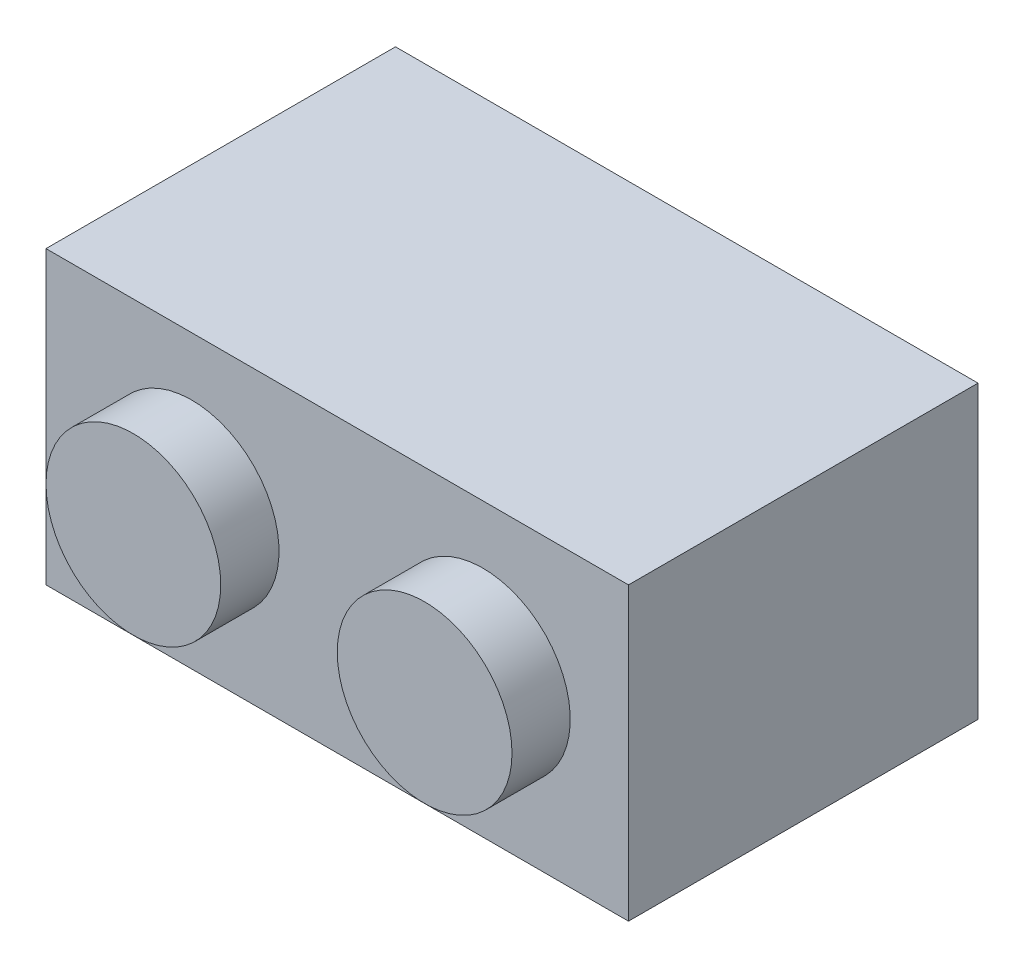
ISO-10303-21;
HEADER;
FILE_DESCRIPTION(('STEP AP214'),'2;1');
FILE_NAME('part.step','',(''),(''),'','','');
FILE_SCHEMA(('AUTOMOTIVE_DESIGN { 1 0 10303 214 1 1 1 1 }'));
ENDSEC;
DATA;
#1=APPLICATION_CONTEXT('core data for automotive mechanical design processes');
#2=APPLICATION_PROTOCOL_DEFINITION('international standard','automotive_design',2000,#1);
#3=PRODUCT_CONTEXT('',#1,'mechanical');
#4=PRODUCT('Part','Part','',(#3));
#5=PRODUCT_RELATED_PRODUCT_CATEGORY('part','',(#4));
#6=PRODUCT_DEFINITION_FORMATION('','',#4);
#7=PRODUCT_DEFINITION_CONTEXT('part definition',#1,'design');
#8=PRODUCT_DEFINITION('design','',#6,#7);
#9=PRODUCT_DEFINITION_SHAPE('','',#8);
#10=(LENGTH_UNIT() NAMED_UNIT(*) SI_UNIT(.MILLI.,.METRE.));
#11=(NAMED_UNIT(*) PLANE_ANGLE_UNIT() SI_UNIT($,.RADIAN.));
#12=(NAMED_UNIT(*) SI_UNIT($,.STERADIAN.) SOLID_ANGLE_UNIT());
#13=UNCERTAINTY_MEASURE_WITH_UNIT(LENGTH_MEASURE(1.E-05),#10,'distance_accuracy_value','');
#14=(GEOMETRIC_REPRESENTATION_CONTEXT(3) GLOBAL_UNCERTAINTY_ASSIGNED_CONTEXT((#13)) GLOBAL_UNIT_ASSIGNED_CONTEXT((#10,
#11,#12)) REPRESENTATION_CONTEXT('',''));
#15=CARTESIAN_POINT('',(0.,0.,0.));
#16=DIRECTION('',(0.,0.,1.));
#17=DIRECTION('',(1.,0.,0.));
#18=AXIS2_PLACEMENT_3D('',#15,#16,#17);
#19=CARTESIAN_POINT('',(0.,0.,7.9375));
#20=DIRECTION('',(0.,0.,-1.));
#21=DIRECTION('',(-1.,0.,0.));
#22=AXIS2_PLACEMENT_3D('',#19,#20,#21);
#23=PLANE('',#22);
#24=CARTESIAN_POINT('',(11.90625,3.96875,7.9375));
#25=DIRECTION('',(0.,0.,-1.));
#26=DIRECTION('',(-1.,0.,0.));
#27=AXIS2_PLACEMENT_3D('',#24,#25,#26);
#28=CIRCLE('',#27,0.793750000000002);
#29=CARTESIAN_POINT('',(11.1125,3.96875,7.9375));
#30=VERTEX_POINT('',#29);
#31=EDGE_CURVE('E131',#30,#30,#28,.F.);
#32=ORIENTED_EDGE('',*,*,#31,.T.);
#33=EDGE_LOOP('',(#32));
#34=FACE_BOUND('',#33,.T.);
#35=DIRECTION('',(0.,1.,0.));
#36=VECTOR('',#35,1.);
#37=CARTESIAN_POINT('',(1.5875,0.,7.9375));
#38=LINE('',#37,#36);
#39=CARTESIAN_POINT('',(1.5875,1.5875,7.9375));
#40=VERTEX_POINT('',#39);
#41=CARTESIAN_POINT('',(1.5875,6.35,7.9375));
#42=VERTEX_POINT('',#41);
#43=EDGE_CURVE('E127',#40,#42,#38,.T.);
#44=ORIENTED_EDGE('',*,*,#43,.T.);
#45=DIRECTION('',(1.,0.,0.));
#46=VECTOR('',#45,1.);
#47=CARTESIAN_POINT('',(0.,6.35,7.9375));
#48=LINE('',#47,#46);
#49=CARTESIAN_POINT('',(14.2875,6.35,7.9375));
#50=VERTEX_POINT('',#49);
#51=EDGE_CURVE('E125',#42,#50,#48,.T.);
#52=ORIENTED_EDGE('',*,*,#51,.T.);
#53=DIRECTION('',(0.,1.,0.));
#54=VECTOR('',#53,1.);
#55=CARTESIAN_POINT('',(14.2875,0.,7.9375));
#56=LINE('',#55,#54);
#57=CARTESIAN_POINT('',(14.2875,1.5875,7.9375));
#58=VERTEX_POINT('',#57);
#59=EDGE_CURVE('E116',#58,#50,#56,.T.);
#60=ORIENTED_EDGE('',*,*,#59,.F.);
#61=DIRECTION('',(1.,0.,0.));
#62=VECTOR('',#61,1.);
#63=CARTESIAN_POINT('',(0.,1.5875,7.9375));
#64=LINE('',#63,#62);
#65=EDGE_CURVE('E105',#40,#58,#64,.T.);
#66=ORIENTED_EDGE('',*,*,#65,.F.);
#67=EDGE_LOOP('',(#44,#52,#60,#66));
#68=FACE_BOUND('',#67,.T.);
#69=CARTESIAN_POINT('',(3.96875,3.96875,7.9375));
#70=DIRECTION('',(0.,0.,-1.));
#71=DIRECTION('',(-1.,0.,0.));
#72=AXIS2_PLACEMENT_3D('',#69,#70,#71);
#73=CIRCLE('',#72,0.793750000000002);
#74=CARTESIAN_POINT('',(3.175,3.96875,7.9375));
#75=VERTEX_POINT('',#74);
#76=EDGE_CURVE('E135',#75,#75,#73,.F.);
#77=ORIENTED_EDGE('',*,*,#76,.T.);
#78=EDGE_LOOP('',(#77));
#79=FACE_BOUND('',#78,.T.);
#80=CARTESIAN_POINT('',(7.9375,3.96875,7.9375));
#81=DIRECTION('',(0.,0.,-1.));
#82=DIRECTION('',(-1.,0.,0.));
#83=AXIS2_PLACEMENT_3D('',#80,#81,#82);
#84=CIRCLE('',#83,1.5875);
#85=CARTESIAN_POINT('',(6.35,3.96875,7.9375));
#86=VERTEX_POINT('',#85);
#87=EDGE_CURVE('E266',#86,#86,#84,.T.);
#88=ORIENTED_EDGE('',*,*,#87,.F.);
#89=EDGE_LOOP('',(#88));
#90=FACE_BOUND('',#89,.T.);
#91=ADVANCED_FACE('F32',(#34,#68,#79,#90),#23,.T.);
#92=CARTESIAN_POINT('',(0.,0.,9.525));
#93=DIRECTION('',(0.,0.,-1.));
#94=DIRECTION('',(-1.,0.,0.));
#95=AXIS2_PLACEMENT_3D('',#92,#93,#94);
#96=PLANE('',#95);
#97=CARTESIAN_POINT('',(3.96875,3.96875,9.525));
#98=DIRECTION('',(0.,0.,-1.));
#99=DIRECTION('',(-1.,0.,0.));
#100=AXIS2_PLACEMENT_3D('',#97,#98,#99);
#101=CIRCLE('',#100,2.38125);
#102=CARTESIAN_POINT('',(1.5875,3.96875,9.525));
#103=VERTEX_POINT('',#102);
#104=EDGE_CURVE('E40',#103,#103,#101,.F.);
#105=ORIENTED_EDGE('',*,*,#104,.F.);
#106=EDGE_LOOP('',(#105));
#107=FACE_BOUND('',#106,.T.);
#108=DIRECTION('',(0.,1.,0.));
#109=VECTOR('',#108,1.);
#110=CARTESIAN_POINT('',(0.,0.,9.525));
#111=LINE('',#110,#109);
#112=CARTESIAN_POINT('',(0.,0.,9.525));
#113=VERTEX_POINT('',#112);
#114=CARTESIAN_POINT('',(0.,7.9375,9.525));
#115=VERTEX_POINT('',#114);
#116=EDGE_CURVE('E161',#113,#115,#111,.T.);
#117=ORIENTED_EDGE('',*,*,#116,.F.);
#118=DIRECTION('',(1.,0.,0.));
#119=VECTOR('',#118,1.);
#120=CARTESIAN_POINT('',(0.,0.,9.525));
#121=LINE('',#120,#119);
#122=CARTESIAN_POINT('',(15.875,0.,9.525));
#123=VERTEX_POINT('',#122);
#124=EDGE_CURVE('E168',#113,#123,#121,.T.);
#125=ORIENTED_EDGE('',*,*,#124,.T.);
#126=DIRECTION('',(0.,1.,0.));
#127=VECTOR('',#126,1.);
#128=CARTESIAN_POINT('',(15.875,0.,9.525));
#129=LINE('',#128,#127);
#130=CARTESIAN_POINT('',(15.875,7.9375,9.525));
#131=VERTEX_POINT('',#130);
#132=EDGE_CURVE('E166',#123,#131,#129,.T.);
#133=ORIENTED_EDGE('',*,*,#132,.T.);
#134=DIRECTION('',(1.,0.,0.));
#135=VECTOR('',#134,1.);
#136=CARTESIAN_POINT('',(0.,7.9375,9.525));
#137=LINE('',#136,#135);
#138=EDGE_CURVE('E163',#115,#131,#137,.T.);
#139=ORIENTED_EDGE('',*,*,#138,.F.);
#140=EDGE_LOOP('',(#117,#125,#133,#139));
#141=FACE_BOUND('',#140,.T.);
#142=CARTESIAN_POINT('',(11.90625,3.96875,9.525));
#143=DIRECTION('',(0.,0.,-1.));
#144=DIRECTION('',(-1.,0.,0.));
#145=AXIS2_PLACEMENT_3D('',#142,#143,#144);
#146=CIRCLE('',#145,2.38125);
#147=CARTESIAN_POINT('',(9.525,3.96875,9.525));
#148=VERTEX_POINT('',#147);
#149=EDGE_CURVE('E11',#148,#148,#146,.F.);
#150=ORIENTED_EDGE('',*,*,#149,.F.);
#151=EDGE_LOOP('',(#150));
#152=FACE_BOUND('',#151,.T.);
#153=ADVANCED_FACE('F190',(#107,#141,#152),#96,.F.);
#154=CARTESIAN_POINT('',(0.,0.,9.525));
#155=DIRECTION('',(-1.,0.,0.));
#156=DIRECTION('',(0.,0.,1.));
#157=AXIS2_PLACEMENT_3D('',#154,#155,#156);
#158=PLANE('',#157);
#159=DIRECTION('',(0.,1.,0.));
#160=VECTOR('',#159,1.);
#161=CARTESIAN_POINT('',(0.,0.,0.));
#162=LINE('',#161,#160);
#163=CARTESIAN_POINT('',(0.,0.,0.));
#164=VERTEX_POINT('',#163);
#165=CARTESIAN_POINT('',(0.,7.9375,0.));
#166=VERTEX_POINT('',#165);
#167=EDGE_CURVE('E160',#164,#166,#162,.T.);
#168=ORIENTED_EDGE('',*,*,#167,.F.);
#169=DIRECTION('',(0.,0.,-1.));
#170=VECTOR('',#169,1.);
#171=CARTESIAN_POINT('',(0.,0.,9.525));
#172=LINE('',#171,#170);
#173=EDGE_CURVE('E56',#113,#164,#172,.T.);
#174=ORIENTED_EDGE('',*,*,#173,.F.);
#175=ORIENTED_EDGE('',*,*,#116,.T.);
#176=DIRECTION('',(0.,0.,-1.));
#177=VECTOR('',#176,1.);
#178=CARTESIAN_POINT('',(0.,7.9375,9.525));
#179=LINE('',#178,#177);
#180=EDGE_CURVE('E81',#115,#166,#179,.T.);
#181=ORIENTED_EDGE('',*,*,#180,.T.);
#182=EDGE_LOOP('',(#168,#174,#175,#181));
#183=FACE_BOUND('',#182,.T.);
#184=ADVANCED_FACE('F34',(#183),#158,.T.);
#185=CARTESIAN_POINT('',(0.,0.,9.525));
#186=DIRECTION('',(0.,1.,0.));
#187=DIRECTION('',(0.,0.,1.));
#188=AXIS2_PLACEMENT_3D('',#185,#186,#187);
#189=PLANE('',#188);
#190=DIRECTION('',(1.,0.,0.));
#191=VECTOR('',#190,1.);
#192=CARTESIAN_POINT('',(0.,0.,0.));
#193=LINE('',#192,#191);
#194=CARTESIAN_POINT('',(15.875,0.,0.));
#195=VERTEX_POINT('',#194);
#196=EDGE_CURVE('E164',#164,#195,#193,.T.);
#197=ORIENTED_EDGE('',*,*,#196,.T.);
#198=DIRECTION('',(0.,0.,-1.));
#199=VECTOR('',#198,1.);
#200=CARTESIAN_POINT('',(15.875,0.,9.525));
#201=LINE('',#200,#199);
#202=EDGE_CURVE('E180',#123,#195,#201,.T.);
#203=ORIENTED_EDGE('',*,*,#202,.F.);
#204=ORIENTED_EDGE('',*,*,#124,.F.);
#205=ORIENTED_EDGE('',*,*,#173,.T.);
#206=EDGE_LOOP('',(#197,#203,#204,#205));
#207=FACE_BOUND('',#206,.T.);
#208=ADVANCED_FACE('F286',(#207),#189,.F.);
#209=CARTESIAN_POINT('',(15.875,0.,9.525));
#210=DIRECTION('',(-1.,0.,0.));
#211=DIRECTION('',(0.,0.,1.));
#212=AXIS2_PLACEMENT_3D('',#209,#210,#211);
#213=PLANE('',#212);
#214=DIRECTION('',(0.,1.,0.));
#215=VECTOR('',#214,1.);
#216=CARTESIAN_POINT('',(15.875,0.,0.));
#217=LINE('',#216,#215);
#218=CARTESIAN_POINT('',(15.875,7.9375,0.));
#219=VERTEX_POINT('',#218);
#220=EDGE_CURVE('E175',#195,#219,#217,.T.);
#221=ORIENTED_EDGE('',*,*,#220,.T.);
#222=DIRECTION('',(0.,0.,-1.));
#223=VECTOR('',#222,1.);
#224=CARTESIAN_POINT('',(15.875,7.9375,9.525));
#225=LINE('',#224,#223);
#226=EDGE_CURVE('E183',#131,#219,#225,.T.);
#227=ORIENTED_EDGE('',*,*,#226,.F.);
#228=ORIENTED_EDGE('',*,*,#132,.F.);
#229=ORIENTED_EDGE('',*,*,#202,.T.);
#230=EDGE_LOOP('',(#221,#227,#228,#229));
#231=FACE_BOUND('',#230,.T.);
#232=ADVANCED_FACE('F284',(#231),#213,.F.);
#233=CARTESIAN_POINT('',(0.,7.9375,9.525));
#234=DIRECTION('',(0.,1.,0.));
#235=DIRECTION('',(0.,0.,1.));
#236=AXIS2_PLACEMENT_3D('',#233,#234,#235);
#237=PLANE('',#236);
#238=DIRECTION('',(1.,0.,0.));
#239=VECTOR('',#238,1.);
#240=CARTESIAN_POINT('',(0.,7.9375,0.));
#241=LINE('',#240,#239);
#242=EDGE_CURVE('E172',#166,#219,#241,.T.);
#243=ORIENTED_EDGE('',*,*,#242,.F.);
#244=ORIENTED_EDGE('',*,*,#180,.F.);
#245=ORIENTED_EDGE('',*,*,#138,.T.);
#246=ORIENTED_EDGE('',*,*,#226,.T.);
#247=EDGE_LOOP('',(#243,#244,#245,#246));
#248=FACE_BOUND('',#247,.T.);
#249=ADVANCED_FACE('F278',(#248),#237,.T.);
#250=CARTESIAN_POINT('',(0.,0.,0.));
#251=DIRECTION('',(0.,0.,-1.));
#252=DIRECTION('',(-1.,0.,0.));
#253=AXIS2_PLACEMENT_3D('',#250,#251,#252);
#254=PLANE('',#253);
#255=DIRECTION('',(0.,1.,0.));
#256=VECTOR('',#255,1.);
#257=CARTESIAN_POINT('',(1.5875,0.,0.));
#258=LINE('',#257,#256);
#259=CARTESIAN_POINT('',(1.5875,1.5875,0.));
#260=VERTEX_POINT('',#259);
#261=CARTESIAN_POINT('',(1.5875,6.35,0.));
#262=VERTEX_POINT('',#261);
#263=EDGE_CURVE('E142',#260,#262,#258,.T.);
#264=ORIENTED_EDGE('',*,*,#263,.F.);
#265=DIRECTION('',(1.,0.,0.));
#266=VECTOR('',#265,1.);
#267=CARTESIAN_POINT('',(0.,1.5875,0.));
#268=LINE('',#267,#266);
#269=CARTESIAN_POINT('',(14.2875,1.5875,0.));
#270=VERTEX_POINT('',#269);
#271=EDGE_CURVE('E153',#260,#270,#268,.T.);
#272=ORIENTED_EDGE('',*,*,#271,.T.);
#273=DIRECTION('',(0.,1.,0.));
#274=VECTOR('',#273,1.);
#275=CARTESIAN_POINT('',(14.2875,0.,0.));
#276=LINE('',#275,#274);
#277=CARTESIAN_POINT('',(14.2875,6.35,0.));
#278=VERTEX_POINT('',#277);
#279=EDGE_CURVE('E47',#270,#278,#276,.T.);
#280=ORIENTED_EDGE('',*,*,#279,.T.);
#281=DIRECTION('',(1.,0.,0.));
#282=VECTOR('',#281,1.);
#283=CARTESIAN_POINT('',(0.,6.35,0.));
#284=LINE('',#283,#282);
#285=EDGE_CURVE('E149',#262,#278,#284,.T.);
#286=ORIENTED_EDGE('',*,*,#285,.F.);
#287=EDGE_LOOP('',(#264,#272,#280,#286));
#288=FACE_BOUND('',#287,.T.);
#289=ORIENTED_EDGE('',*,*,#167,.T.);
#290=ORIENTED_EDGE('',*,*,#242,.T.);
#291=ORIENTED_EDGE('',*,*,#220,.F.);
#292=ORIENTED_EDGE('',*,*,#196,.F.);
#293=EDGE_LOOP('',(#289,#290,#291,#292));
#294=FACE_BOUND('',#293,.T.);
#295=ADVANCED_FACE('F275',(#288,#294),#254,.T.);
#296=CARTESIAN_POINT('',(3.96875,3.96875,11.1125));
#297=DIRECTION('',(0.,0.,-1.));
#298=DIRECTION('',(-1.,0.,0.));
#299=AXIS2_PLACEMENT_3D('',#296,#297,#298);
#300=CYLINDRICAL_SURFACE('',#299,2.38125);
#301=CARTESIAN_POINT('',(3.96875,3.96875,11.1125));
#302=DIRECTION('',(0.,0.,1.));
#303=DIRECTION('',(1.,0.,0.));
#304=AXIS2_PLACEMENT_3D('',#301,#302,#303);
#305=CIRCLE('',#304,2.38125);
#306=CARTESIAN_POINT('',(6.35,3.96875,11.1125));
#307=VERTEX_POINT('',#306);
#308=EDGE_CURVE('E157',#307,#307,#305,.T.);
#309=ORIENTED_EDGE('',*,*,#308,.F.);
#310=EDGE_LOOP('',(#309));
#311=FACE_BOUND('',#310,.T.);
#312=ORIENTED_EDGE('',*,*,#104,.T.);
#313=EDGE_LOOP('',(#312));
#314=FACE_BOUND('',#313,.T.);
#315=ADVANCED_FACE('F188',(#311,#314),#300,.T.);
#316=CARTESIAN_POINT('',(3.96875,3.96875,11.1125));
#317=DIRECTION('',(0.,0.,1.));
#318=DIRECTION('',(1.,0.,0.));
#319=AXIS2_PLACEMENT_3D('',#316,#317,#318);
#320=PLANE('',#319);
#321=ORIENTED_EDGE('',*,*,#308,.T.);
#322=EDGE_LOOP('',(#321));
#323=FACE_BOUND('',#322,.T.);
#324=ADVANCED_FACE('F201',(#323),#320,.T.);
#325=CARTESIAN_POINT('',(11.90625,3.96875,11.1125));
#326=DIRECTION('',(0.,0.,-1.));
#327=DIRECTION('',(-1.,0.,0.));
#328=AXIS2_PLACEMENT_3D('',#325,#326,#327);
#329=CYLINDRICAL_SURFACE('',#328,2.38125);
#330=CARTESIAN_POINT('',(11.90625,3.96875,11.1125));
#331=DIRECTION('',(0.,0.,1.));
#332=DIRECTION('',(1.,0.,0.));
#333=AXIS2_PLACEMENT_3D('',#330,#331,#332);
#334=CIRCLE('',#333,2.38125);
#335=CARTESIAN_POINT('',(14.2875,3.96875,11.1125));
#336=VERTEX_POINT('',#335);
#337=EDGE_CURVE('E134',#336,#336,#334,.T.);
#338=ORIENTED_EDGE('',*,*,#337,.F.);
#339=EDGE_LOOP('',(#338));
#340=FACE_BOUND('',#339,.T.);
#341=ORIENTED_EDGE('',*,*,#149,.T.);
#342=EDGE_LOOP('',(#341));
#343=FACE_BOUND('',#342,.T.);
#344=ADVANCED_FACE('F198',(#340,#343),#329,.T.);
#345=CARTESIAN_POINT('',(11.90625,3.96875,11.1125));
#346=DIRECTION('',(0.,0.,1.));
#347=DIRECTION('',(1.,0.,0.));
#348=AXIS2_PLACEMENT_3D('',#345,#346,#347);
#349=PLANE('',#348);
#350=ORIENTED_EDGE('',*,*,#337,.T.);
#351=EDGE_LOOP('',(#350));
#352=FACE_BOUND('',#351,.T.);
#353=ADVANCED_FACE('F200',(#352),#349,.T.);
#354=CARTESIAN_POINT('',(1.5875,0.,9.525));
#355=DIRECTION('',(-1.,0.,0.));
#356=DIRECTION('',(0.,0.,1.));
#357=AXIS2_PLACEMENT_3D('',#354,#355,#356);
#358=PLANE('',#357);
#359=ORIENTED_EDGE('',*,*,#263,.T.);
#360=DIRECTION('',(0.,0.,-1.));
#361=VECTOR('',#360,1.);
#362=CARTESIAN_POINT('',(1.5875,6.35,9.525));
#363=LINE('',#362,#361);
#364=EDGE_CURVE('E115',#42,#262,#363,.T.);
#365=ORIENTED_EDGE('',*,*,#364,.F.);
#366=ORIENTED_EDGE('',*,*,#43,.F.);
#367=DIRECTION('',(0.,0.,-1.));
#368=VECTOR('',#367,1.);
#369=CARTESIAN_POINT('',(1.5875,1.5875,9.525));
#370=LINE('',#369,#368);
#371=EDGE_CURVE('E110',#40,#260,#370,.T.);
#372=ORIENTED_EDGE('',*,*,#371,.T.);
#373=EDGE_LOOP('',(#359,#365,#366,#372));
#374=FACE_BOUND('',#373,.T.);
#375=ADVANCED_FACE('F208',(#374),#358,.F.);
#376=CARTESIAN_POINT('',(0.,1.5875,9.525));
#377=DIRECTION('',(0.,1.,0.));
#378=DIRECTION('',(0.,0.,1.));
#379=AXIS2_PLACEMENT_3D('',#376,#377,#378);
#380=PLANE('',#379);
#381=ORIENTED_EDGE('',*,*,#271,.F.);
#382=ORIENTED_EDGE('',*,*,#371,.F.);
#383=ORIENTED_EDGE('',*,*,#65,.T.);
#384=DIRECTION('',(0.,0.,-1.));
#385=VECTOR('',#384,1.);
#386=CARTESIAN_POINT('',(14.2875,1.5875,9.525));
#387=LINE('',#386,#385);
#388=EDGE_CURVE('E108',#58,#270,#387,.T.);
#389=ORIENTED_EDGE('',*,*,#388,.T.);
#390=EDGE_LOOP('',(#381,#382,#383,#389));
#391=FACE_BOUND('',#390,.T.);
#392=ADVANCED_FACE('F107',(#391),#380,.T.);
#393=CARTESIAN_POINT('',(14.2875,0.,9.525));
#394=DIRECTION('',(-1.,0.,0.));
#395=DIRECTION('',(0.,0.,1.));
#396=AXIS2_PLACEMENT_3D('',#393,#394,#395);
#397=PLANE('',#396);
#398=ORIENTED_EDGE('',*,*,#279,.F.);
#399=ORIENTED_EDGE('',*,*,#388,.F.);
#400=ORIENTED_EDGE('',*,*,#59,.T.);
#401=DIRECTION('',(0.,0.,-1.));
#402=VECTOR('',#401,1.);
#403=CARTESIAN_POINT('',(14.2875,6.35,9.525));
#404=LINE('',#403,#402);
#405=EDGE_CURVE('E120',#50,#278,#404,.T.);
#406=ORIENTED_EDGE('',*,*,#405,.T.);
#407=EDGE_LOOP('',(#398,#399,#400,#406));
#408=FACE_BOUND('',#407,.T.);
#409=ADVANCED_FACE('F118',(#408),#397,.T.);
#410=CARTESIAN_POINT('',(0.,6.35,9.525));
#411=DIRECTION('',(0.,1.,0.));
#412=DIRECTION('',(0.,0.,1.));
#413=AXIS2_PLACEMENT_3D('',#410,#411,#412);
#414=PLANE('',#413);
#415=ORIENTED_EDGE('',*,*,#285,.T.);
#416=ORIENTED_EDGE('',*,*,#405,.F.);
#417=ORIENTED_EDGE('',*,*,#51,.F.);
#418=ORIENTED_EDGE('',*,*,#364,.T.);
#419=EDGE_LOOP('',(#415,#416,#417,#418));
#420=FACE_BOUND('',#419,.T.);
#421=ADVANCED_FACE('F230',(#420),#414,.F.);
#422=CARTESIAN_POINT('',(3.96875,3.96875,11.1125));
#423=DIRECTION('',(0.,0.,-1.));
#424=DIRECTION('',(-1.,0.,0.));
#425=AXIS2_PLACEMENT_3D('',#422,#423,#424);
#426=CYLINDRICAL_SURFACE('',#425,0.793750000000002);
#427=CARTESIAN_POINT('',(3.96875,3.96875,9.525));
#428=DIRECTION('',(0.,0.,1.));
#429=DIRECTION('',(1.,0.,0.));
#430=AXIS2_PLACEMENT_3D('',#427,#428,#429);
#431=CIRCLE('',#430,0.793750000000002);
#432=CARTESIAN_POINT('',(4.7625,3.96875,9.525));
#433=VERTEX_POINT('',#432);
#434=EDGE_CURVE('E139',#433,#433,#431,.T.);
#435=ORIENTED_EDGE('',*,*,#434,.T.);
#436=EDGE_LOOP('',(#435));
#437=FACE_BOUND('',#436,.T.);
#438=ORIENTED_EDGE('',*,*,#76,.F.);
#439=EDGE_LOOP('',(#438));
#440=FACE_BOUND('',#439,.T.);
#441=ADVANCED_FACE('F233',(#437,#440),#426,.F.);
#442=CARTESIAN_POINT('',(3.96875,3.96875,9.525));
#443=DIRECTION('',(0.,0.,1.));
#444=DIRECTION('',(1.,0.,0.));
#445=AXIS2_PLACEMENT_3D('',#442,#443,#444);
#446=PLANE('',#445);
#447=ORIENTED_EDGE('',*,*,#434,.F.);
#448=EDGE_LOOP('',(#447));
#449=FACE_BOUND('',#448,.T.);
#450=ADVANCED_FACE('F237',(#449),#446,.F.);
#451=CARTESIAN_POINT('',(11.90625,3.96875,11.1125));
#452=DIRECTION('',(0.,0.,-1.));
#453=DIRECTION('',(-1.,0.,0.));
#454=AXIS2_PLACEMENT_3D('',#451,#452,#453);
#455=CYLINDRICAL_SURFACE('',#454,0.793750000000002);
#456=CARTESIAN_POINT('',(11.90625,3.96875,9.525));
#457=DIRECTION('',(0.,0.,1.));
#458=DIRECTION('',(1.,0.,0.));
#459=AXIS2_PLACEMENT_3D('',#456,#457,#458);
#460=CIRCLE('',#459,0.793750000000002);
#461=CARTESIAN_POINT('',(12.7,3.96875,9.525));
#462=VERTEX_POINT('',#461);
#463=EDGE_CURVE('E143',#462,#462,#460,.T.);
#464=ORIENTED_EDGE('',*,*,#463,.T.);
#465=EDGE_LOOP('',(#464));
#466=FACE_BOUND('',#465,.T.);
#467=ORIENTED_EDGE('',*,*,#31,.F.);
#468=EDGE_LOOP('',(#467));
#469=FACE_BOUND('',#468,.T.);
#470=ADVANCED_FACE('F241',(#466,#469),#455,.F.);
#471=CARTESIAN_POINT('',(11.90625,3.96875,9.525));
#472=DIRECTION('',(0.,0.,1.));
#473=DIRECTION('',(1.,0.,0.));
#474=AXIS2_PLACEMENT_3D('',#471,#472,#473);
#475=PLANE('',#474);
#476=ORIENTED_EDGE('',*,*,#463,.F.);
#477=EDGE_LOOP('',(#476));
#478=FACE_BOUND('',#477,.T.);
#479=ADVANCED_FACE('F245',(#478),#475,.F.);
#480=CARTESIAN_POINT('',(7.9375,3.96875,0.));
#481=DIRECTION('',(0.,0.,1.));
#482=DIRECTION('',(1.,0.,0.));
#483=AXIS2_PLACEMENT_3D('',#480,#481,#482);
#484=CYLINDRICAL_SURFACE('',#483,1.5875);
#485=CARTESIAN_POINT('',(7.9375,3.96875,0.));
#486=DIRECTION('',(0.,0.,-1.));
#487=DIRECTION('',(-1.,0.,0.));
#488=AXIS2_PLACEMENT_3D('',#485,#486,#487);
#489=CIRCLE('',#488,1.5875);
#490=CARTESIAN_POINT('',(6.35,3.96875,0.));
#491=VERTEX_POINT('',#490);
#492=EDGE_CURVE('E146',#491,#491,#489,.T.);
#493=ORIENTED_EDGE('',*,*,#492,.F.);
#494=EDGE_LOOP('',(#493));
#495=FACE_BOUND('',#494,.T.);
#496=ORIENTED_EDGE('',*,*,#87,.T.);
#497=EDGE_LOOP('',(#496));
#498=FACE_BOUND('',#497,.T.);
#499=ADVANCED_FACE('F221',(#495,#498),#484,.T.);
#500=CARTESIAN_POINT('',(7.9375,3.96875,0.));
#501=DIRECTION('',(0.,0.,-1.));
#502=DIRECTION('',(-1.,0.,0.));
#503=AXIS2_PLACEMENT_3D('',#500,#501,#502);
#504=PLANE('',#503);
#505=ORIENTED_EDGE('',*,*,#492,.T.);
#506=EDGE_LOOP('',(#505));
#507=FACE_BOUND('',#506,.T.);
#508=ADVANCED_FACE('F252',(#507),#504,.T.);
#509=CLOSED_SHELL('',(#91,#153,#184,#208,#232,#249,#295,#315,#324,#344,#353,#375,#392,#409,#421,
#441,#450,#470,#479,#499,#508));
#510=MANIFOLD_SOLID_BREP('B2',#509);
#511=ADVANCED_BREP_SHAPE_REPRESENTATION('',(#18,#510),#14);
#512=SHAPE_DEFINITION_REPRESENTATION(#9,#511);
ENDSEC;
END-ISO-10303-21;
